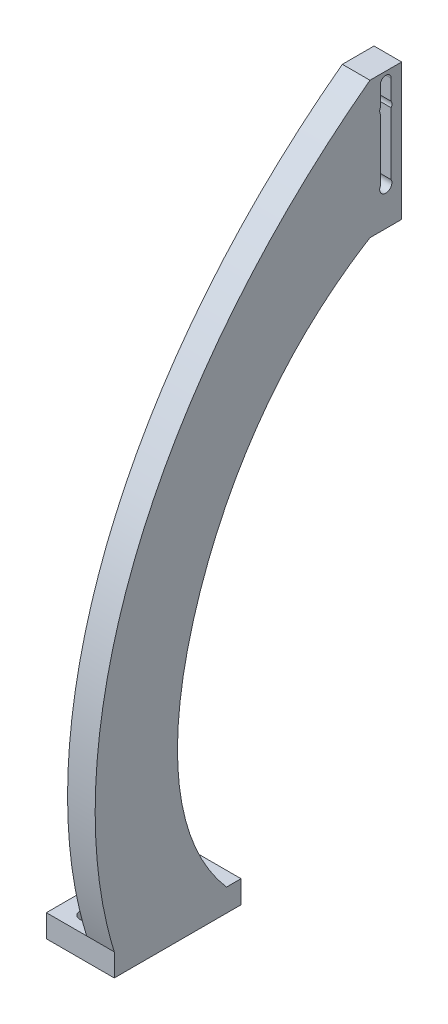
ISO-10303-21;
HEADER;
FILE_DESCRIPTION(('STEP AP214'),'2;1');
FILE_NAME('part.step','',(''),(''),'','','');
FILE_SCHEMA(('AUTOMOTIVE_DESIGN { 1 0 10303 214 1 1 1 1 }'));
ENDSEC;
DATA;
#1=APPLICATION_CONTEXT('core data for automotive mechanical design processes');
#2=APPLICATION_PROTOCOL_DEFINITION('international standard','automotive_design',2000,#1);
#3=PRODUCT_CONTEXT('',#1,'mechanical');
#4=PRODUCT('Part','Part','',(#3));
#5=PRODUCT_RELATED_PRODUCT_CATEGORY('part','',(#4));
#6=PRODUCT_DEFINITION_FORMATION('','',#4);
#7=PRODUCT_DEFINITION_CONTEXT('part definition',#1,'design');
#8=PRODUCT_DEFINITION('design','',#6,#7);
#9=PRODUCT_DEFINITION_SHAPE('','',#8);
#10=(LENGTH_UNIT() NAMED_UNIT(*) SI_UNIT(.MILLI.,.METRE.));
#11=(NAMED_UNIT(*) PLANE_ANGLE_UNIT() SI_UNIT($,.RADIAN.));
#12=(NAMED_UNIT(*) SI_UNIT($,.STERADIAN.) SOLID_ANGLE_UNIT());
#13=UNCERTAINTY_MEASURE_WITH_UNIT(LENGTH_MEASURE(1.E-05),#10,'distance_accuracy_value','');
#14=(GEOMETRIC_REPRESENTATION_CONTEXT(3) GLOBAL_UNCERTAINTY_ASSIGNED_CONTEXT((#13)) GLOBAL_UNIT_ASSIGNED_CONTEXT((#10,
#11,#12)) REPRESENTATION_CONTEXT('',''));
#15=CARTESIAN_POINT('',(0.,0.,0.));
#16=DIRECTION('',(0.,0.,1.));
#17=DIRECTION('',(1.,0.,0.));
#18=AXIS2_PLACEMENT_3D('',#15,#16,#17);
#19=CARTESIAN_POINT('',(-2.,136.5,-45.9823957456189));
#20=DIRECTION('',(1.,0.,0.));
#21=DIRECTION('',(0.,0.,-1.));
#22=AXIS2_PLACEMENT_3D('',#19,#20,#21);
#23=CYLINDRICAL_SURFACE('',#22,1.35);
#24=CARTESIAN_POINT('',(5.,136.5,-45.9823957456189));
#25=DIRECTION('',(1.,0.,0.));
#26=DIRECTION('',(0.,0.,-1.));
#27=AXIS2_PLACEMENT_3D('',#24,#25,#26);
#28=CIRCLE('',#27,1.35);
#29=CARTESIAN_POINT('',(5.,137.118465843843,-44.7823957456189));
#30=VERTEX_POINT('',#29);
#31=CARTESIAN_POINT('',(5.,135.881534156157,-44.7823957456189));
#32=VERTEX_POINT('',#31);
#33=EDGE_CURVE('E235',#30,#32,#28,.T.);
#34=ORIENTED_EDGE('',*,*,#33,.T.);
#35=DIRECTION('',(1.,0.,0.));
#36=VECTOR('',#35,1.);
#37=CARTESIAN_POINT('',(-2.,135.881534156157,-44.7823957456189));
#38=LINE('',#37,#36);
#39=CARTESIAN_POINT('',(-1.09999999999157,135.881534156157,-44.7823957456189));
#40=VERTEX_POINT('',#39);
#41=EDGE_CURVE('E11',#32,#40,#38,.F.);
#42=ORIENTED_EDGE('',*,*,#41,.T.);
#43=CARTESIAN_POINT('',(-1.09999999999153,136.5,-45.9823957456189));
#44=DIRECTION('',(-1.,0.,0.));
#45=DIRECTION('',(0.,-1.,0.));
#46=AXIS2_PLACEMENT_3D('',#43,#44,#45);
#47=CIRCLE('',#46,1.35);
#48=CARTESIAN_POINT('',(-1.09999999999162,137.118465843843,-44.7823957456189));
#49=VERTEX_POINT('',#48);
#50=EDGE_CURVE('E244',#40,#49,#47,.T.);
#51=ORIENTED_EDGE('',*,*,#50,.T.);
#52=DIRECTION('',(1.,0.,0.));
#53=VECTOR('',#52,1.);
#54=CARTESIAN_POINT('',(-2.,137.118465843843,-44.7823957456189));
#55=LINE('',#54,#53);
#56=EDGE_CURVE('E51',#49,#30,#55,.T.);
#57=ORIENTED_EDGE('',*,*,#56,.T.);
#58=EDGE_LOOP('',(#34,#42,#51,#57));
#59=FACE_BOUND('',#58,.T.);
#60=ADVANCED_FACE('F42',(#59),#23,.F.);
#61=CARTESIAN_POINT('',(0.,5.,0.));
#62=DIRECTION('',(0.,1.,0.));
#63=DIRECTION('',(0.,0.,1.));
#64=AXIS2_PLACEMENT_3D('',#61,#62,#63);
#65=PLANE('',#64);
#66=DIRECTION('',(0.,0.,1.));
#67=VECTOR('',#66,1.);
#68=CARTESIAN_POINT('',(5.,5.,14.));
#69=LINE('',#68,#67);
#70=CARTESIAN_POINT('',(5.,5.,-14.));
#71=VERTEX_POINT('',#70);
#72=CARTESIAN_POINT('',(5.,5.,-10.794309538416));
#73=VERTEX_POINT('',#72);
#74=EDGE_CURVE('E218',#71,#73,#69,.T.);
#75=ORIENTED_EDGE('',*,*,#74,.F.);
#76=DIRECTION('',(-1.,0.,0.));
#77=VECTOR('',#76,1.);
#78=CARTESIAN_POINT('',(-10.,5.,-14.));
#79=LINE('',#78,#77);
#80=CARTESIAN_POINT('',(-10.,5.,-14.));
#81=VERTEX_POINT('',#80);
#82=EDGE_CURVE('E443',#71,#81,#79,.T.);
#83=ORIENTED_EDGE('',*,*,#82,.T.);
#84=DIRECTION('',(0.,0.,1.));
#85=VECTOR('',#84,1.);
#86=CARTESIAN_POINT('',(-10.,5.,-14.));
#87=LINE('',#86,#85);
#88=CARTESIAN_POINT('',(-10.,5.,14.));
#89=VERTEX_POINT('',#88);
#90=EDGE_CURVE('E446',#81,#89,#87,.T.);
#91=ORIENTED_EDGE('',*,*,#90,.T.);
#92=DIRECTION('',(1.,0.,0.));
#93=VECTOR('',#92,1.);
#94=CARTESIAN_POINT('',(-10.,5.,14.));
#95=LINE('',#94,#93);
#96=CARTESIAN_POINT('',(-1.10000000000038,5.,14.));
#97=VERTEX_POINT('',#96);
#98=EDGE_CURVE('E449',#89,#97,#95,.T.);
#99=ORIENTED_EDGE('',*,*,#98,.T.);
#100=DIRECTION('',(0.,0.,-1.));
#101=VECTOR('',#100,1.);
#102=CARTESIAN_POINT('',(-1.10000000000035,5.,13.9999999999994));
#103=LINE('',#102,#101);
#104=CARTESIAN_POINT('',(-1.10000000000041,5.,-10.794309538416));
#105=VERTEX_POINT('',#104);
#106=EDGE_CURVE('E289',#97,#105,#103,.T.);
#107=ORIENTED_EDGE('',*,*,#106,.T.);
#108=DIRECTION('',(1.,0.,0.));
#109=VECTOR('',#108,1.);
#110=CARTESIAN_POINT('',(-153.493648523779,5.,-10.794309538416));
#111=LINE('',#110,#109);
#112=EDGE_CURVE('E295',#105,#73,#111,.T.);
#113=ORIENTED_EDGE('',*,*,#112,.T.);
#114=EDGE_LOOP('',(#75,#83,#91,#99,#107,#113));
#115=FACE_BOUND('',#114,.T.);
#116=CARTESIAN_POINT('',(-5.,5.,-10.));
#117=DIRECTION('',(0.,1.,0.));
#118=DIRECTION('',(0.,0.,1.));
#119=AXIS2_PLACEMENT_3D('',#116,#117,#118);
#120=CIRCLE('',#119,1.6);
#121=CARTESIAN_POINT('',(-5.,5.,-8.4));
#122=VERTEX_POINT('',#121);
#123=EDGE_CURVE('E429',#122,#122,#120,.T.);
#124=ORIENTED_EDGE('',*,*,#123,.F.);
#125=EDGE_LOOP('',(#124));
#126=FACE_BOUND('',#125,.T.);
#127=CARTESIAN_POINT('',(-5.,5.,9.99999999999998));
#128=DIRECTION('',(0.,1.,0.));
#129=DIRECTION('',(0.,0.,-1.));
#130=AXIS2_PLACEMENT_3D('',#127,#128,#129);
#131=CIRCLE('',#130,1.6);
#132=CARTESIAN_POINT('',(-5.,5.,8.39999999999998));
#133=VERTEX_POINT('',#132);
#134=EDGE_CURVE('E422',#133,#133,#131,.T.);
#135=ORIENTED_EDGE('',*,*,#134,.F.);
#136=EDGE_LOOP('',(#135));
#137=FACE_BOUND('',#136,.T.);
#138=ADVANCED_FACE('F365',(#115,#126,#137),#65,.T.);
#139=CARTESIAN_POINT('',(0.,0.,0.));
#140=DIRECTION('',(0.,1.,0.));
#141=DIRECTION('',(0.,0.,1.));
#142=AXIS2_PLACEMENT_3D('',#139,#140,#141);
#143=PLANE('',#142);
#144=DIRECTION('',(-1.,0.,0.));
#145=VECTOR('',#144,1.);
#146=CARTESIAN_POINT('',(-10.,0.,-14.));
#147=LINE('',#146,#145);
#148=CARTESIAN_POINT('',(5.,0.,-14.));
#149=VERTEX_POINT('',#148);
#150=CARTESIAN_POINT('',(-10.,0.,-14.));
#151=VERTEX_POINT('',#150);
#152=EDGE_CURVE('E433',#149,#151,#147,.T.);
#153=ORIENTED_EDGE('',*,*,#152,.F.);
#154=DIRECTION('',(0.,0.,1.));
#155=VECTOR('',#154,1.);
#156=CARTESIAN_POINT('',(5.,0.,0.));
#157=LINE('',#156,#155);
#158=CARTESIAN_POINT('',(5.,0.,14.));
#159=VERTEX_POINT('',#158);
#160=EDGE_CURVE('E225',#149,#159,#157,.T.);
#161=ORIENTED_EDGE('',*,*,#160,.T.);
#162=DIRECTION('',(1.,0.,0.));
#163=VECTOR('',#162,1.);
#164=CARTESIAN_POINT('',(-10.,0.,14.));
#165=LINE('',#164,#163);
#166=CARTESIAN_POINT('',(-10.,0.,14.));
#167=VERTEX_POINT('',#166);
#168=EDGE_CURVE('E439',#167,#159,#165,.T.);
#169=ORIENTED_EDGE('',*,*,#168,.F.);
#170=DIRECTION('',(0.,0.,1.));
#171=VECTOR('',#170,1.);
#172=CARTESIAN_POINT('',(-10.,0.,-14.));
#173=LINE('',#172,#171);
#174=EDGE_CURVE('E436',#151,#167,#173,.T.);
#175=ORIENTED_EDGE('',*,*,#174,.F.);
#176=EDGE_LOOP('',(#153,#161,#169,#175));
#177=FACE_BOUND('',#176,.T.);
#178=CARTESIAN_POINT('',(-5.,0.,-10.));
#179=DIRECTION('',(0.,1.,0.));
#180=DIRECTION('',(0.,0.,1.));
#181=AXIS2_PLACEMENT_3D('',#178,#179,#180);
#182=CIRCLE('',#181,1.6);
#183=CARTESIAN_POINT('',(-5.,0.,-8.4));
#184=VERTEX_POINT('',#183);
#185=EDGE_CURVE('E426',#184,#184,#182,.T.);
#186=ORIENTED_EDGE('',*,*,#185,.T.);
#187=EDGE_LOOP('',(#186));
#188=FACE_BOUND('',#187,.T.);
#189=CARTESIAN_POINT('',(-5.,0.,9.99999999999998));
#190=DIRECTION('',(0.,1.,0.));
#191=DIRECTION('',(0.,0.,-1.));
#192=AXIS2_PLACEMENT_3D('',#189,#190,#191);
#193=CIRCLE('',#192,1.6);
#194=CARTESIAN_POINT('',(-5.,0.,8.39999999999998));
#195=VERTEX_POINT('',#194);
#196=EDGE_CURVE('E329',#195,#195,#193,.T.);
#197=ORIENTED_EDGE('',*,*,#196,.T.);
#198=EDGE_LOOP('',(#197));
#199=FACE_BOUND('',#198,.T.);
#200=ADVANCED_FACE('F368',(#177,#188,#199),#143,.F.);
#201=CARTESIAN_POINT('',(-10.,5.,-14.));
#202=DIRECTION('',(0.,0.,1.));
#203=DIRECTION('',(1.,0.,0.));
#204=AXIS2_PLACEMENT_3D('',#201,#202,#203);
#205=PLANE('',#204);
#206=ORIENTED_EDGE('',*,*,#82,.F.);
#207=DIRECTION('',(0.,1.,0.));
#208=VECTOR('',#207,1.);
#209=CARTESIAN_POINT('',(5.,-5.,-14.));
#210=LINE('',#209,#208);
#211=EDGE_CURVE('E221',#149,#71,#210,.T.);
#212=ORIENTED_EDGE('',*,*,#211,.F.);
#213=ORIENTED_EDGE('',*,*,#152,.T.);
#214=DIRECTION('',(0.,-1.,0.));
#215=VECTOR('',#214,1.);
#216=CARTESIAN_POINT('',(-10.,5.,-14.));
#217=LINE('',#216,#215);
#218=EDGE_CURVE('E457',#81,#151,#217,.T.);
#219=ORIENTED_EDGE('',*,*,#218,.F.);
#220=EDGE_LOOP('',(#206,#212,#213,#219));
#221=FACE_BOUND('',#220,.T.);
#222=ADVANCED_FACE('F44',(#221),#205,.F.);
#223=CARTESIAN_POINT('',(-10.,5.,-14.));
#224=DIRECTION('',(1.,0.,0.));
#225=DIRECTION('',(0.,0.,-1.));
#226=AXIS2_PLACEMENT_3D('',#223,#224,#225);
#227=PLANE('',#226);
#228=ORIENTED_EDGE('',*,*,#174,.T.);
#229=DIRECTION('',(0.,-1.,0.));
#230=VECTOR('',#229,1.);
#231=CARTESIAN_POINT('',(-10.,5.,14.));
#232=LINE('',#231,#230);
#233=EDGE_CURVE('E453',#89,#167,#232,.T.);
#234=ORIENTED_EDGE('',*,*,#233,.F.);
#235=ORIENTED_EDGE('',*,*,#90,.F.);
#236=ORIENTED_EDGE('',*,*,#218,.T.);
#237=EDGE_LOOP('',(#228,#234,#235,#236));
#238=FACE_BOUND('',#237,.T.);
#239=ADVANCED_FACE('F374',(#238),#227,.F.);
#240=CARTESIAN_POINT('',(-10.,5.,14.));
#241=DIRECTION('',(0.,0.,-1.));
#242=DIRECTION('',(-1.,0.,0.));
#243=AXIS2_PLACEMENT_3D('',#240,#241,#242);
#244=PLANE('',#243);
#245=ORIENTED_EDGE('',*,*,#168,.T.);
#246=DIRECTION('',(0.,1.,0.));
#247=VECTOR('',#246,1.);
#248=CARTESIAN_POINT('',(5.,-5.,14.));
#249=LINE('',#248,#247);
#250=CARTESIAN_POINT('',(5.,5.,14.));
#251=VERTEX_POINT('',#250);
#252=EDGE_CURVE('E222',#159,#251,#249,.T.);
#253=ORIENTED_EDGE('',*,*,#252,.T.);
#254=DIRECTION('',(1.,0.,0.));
#255=VECTOR('',#254,1.);
#256=CARTESIAN_POINT('',(-153.493648523779,5.,14.));
#257=LINE('',#256,#255);
#258=EDGE_CURVE('E302',#97,#251,#257,.T.);
#259=ORIENTED_EDGE('',*,*,#258,.F.);
#260=ORIENTED_EDGE('',*,*,#98,.F.);
#261=ORIENTED_EDGE('',*,*,#233,.T.);
#262=EDGE_LOOP('',(#245,#253,#259,#260,#261));
#263=FACE_BOUND('',#262,.T.);
#264=ADVANCED_FACE('F363',(#263),#244,.F.);
#265=CARTESIAN_POINT('',(-5.,5.,-10.));
#266=DIRECTION('',(0.,-1.,0.));
#267=DIRECTION('',(0.,0.,-1.));
#268=AXIS2_PLACEMENT_3D('',#265,#266,#267);
#269=CYLINDRICAL_SURFACE('',#268,1.6);
#270=ORIENTED_EDGE('',*,*,#123,.T.);
#271=EDGE_LOOP('',(#270));
#272=FACE_BOUND('',#271,.T.);
#273=ORIENTED_EDGE('',*,*,#185,.F.);
#274=EDGE_LOOP('',(#273));
#275=FACE_BOUND('',#274,.T.);
#276=ADVANCED_FACE('F359',(#272,#275),#269,.F.);
#277=CARTESIAN_POINT('',(-5.,5.,9.99999999999998));
#278=DIRECTION('',(0.,-1.,0.));
#279=DIRECTION('',(0.,0.,-1.));
#280=AXIS2_PLACEMENT_3D('',#277,#278,#279);
#281=CYLINDRICAL_SURFACE('',#280,1.6);
#282=ORIENTED_EDGE('',*,*,#134,.T.);
#283=EDGE_LOOP('',(#282));
#284=FACE_BOUND('',#283,.T.);
#285=ORIENTED_EDGE('',*,*,#196,.F.);
#286=EDGE_LOOP('',(#285));
#287=FACE_BOUND('',#286,.T.);
#288=ADVANCED_FACE('F355',(#284,#287),#281,.F.);
#289=CARTESIAN_POINT('',(-1.10000000000133,-6.49999999999645,-42.4823957456187));
#290=DIRECTION('',(-1.,0.,0.));
#291=DIRECTION('',(0.,0.,-1.));
#292=AXIS2_PLACEMENT_3D('',#289,#290,#291);
#293=PLANE('',#292);
#294=DIRECTION('',(0.,1.,0.));
#295=VECTOR('',#294,1.);
#296=CARTESIAN_POINT('',(-1.10000000000134,-6.49999999999645,-44.7823957456189));
#297=LINE('',#296,#295);
#298=CARTESIAN_POINT('',(-1.09999999999251,122.118465843843,-44.7823957456189));
#299=VERTEX_POINT('',#298);
#300=EDGE_CURVE('E211',#299,#40,#297,.T.);
#301=ORIENTED_EDGE('',*,*,#300,.F.);
#302=CARTESIAN_POINT('',(-1.09999999999256,121.5,-45.9823957456189));
#303=DIRECTION('',(-1.,0.,0.));
#304=DIRECTION('',(0.,-1.,0.));
#305=AXIS2_PLACEMENT_3D('',#302,#303,#304);
#306=CIRCLE('',#305,1.35);
#307=CARTESIAN_POINT('',(-1.09999999999252,122.118465843843,-47.1823957456189));
#308=VERTEX_POINT('',#307);
#309=EDGE_CURVE('E239',#308,#299,#306,.T.);
#310=ORIENTED_EDGE('',*,*,#309,.F.);
#311=DIRECTION('',(0.,-1.,0.));
#312=VECTOR('',#311,1.);
#313=CARTESIAN_POINT('',(-1.10000000000135,-6.49999999999645,-47.1823957456189));
#314=LINE('',#313,#312);
#315=CARTESIAN_POINT('',(-1.09999999999162,135.881534156157,-47.1823957456189));
#316=VERTEX_POINT('',#315);
#317=EDGE_CURVE('E200',#316,#308,#314,.T.);
#318=ORIENTED_EDGE('',*,*,#317,.F.);
#319=CARTESIAN_POINT('',(-1.09999999999149,137.118465843843,-47.1823957456189));
#320=VERTEX_POINT('',#319);
#321=EDGE_CURVE('E243',#320,#316,#47,.T.);
#322=ORIENTED_EDGE('',*,*,#321,.F.);
#323=CARTESIAN_POINT('',(-1.09999999999187,141.5,-47.1823957456189));
#324=VERTEX_POINT('',#323);
#325=EDGE_CURVE('E66',#324,#320,#314,.T.);
#326=ORIENTED_EDGE('',*,*,#325,.F.);
#327=CARTESIAN_POINT('',(-1.09999999999118,141.5,-45.9823957456189));
#328=DIRECTION('',(-1.,0.,0.));
#329=DIRECTION('',(0.,-1.,0.));
#330=AXIS2_PLACEMENT_3D('',#327,#328,#329);
#331=CIRCLE('',#330,1.2);
#332=CARTESIAN_POINT('',(-1.09999999999127,141.5,-44.7823957456189));
#333=VERTEX_POINT('',#332);
#334=EDGE_CURVE('E173',#333,#324,#331,.T.);
#335=ORIENTED_EDGE('',*,*,#334,.F.);
#336=EDGE_CURVE('E208',#49,#333,#297,.T.);
#337=ORIENTED_EDGE('',*,*,#336,.F.);
#338=ORIENTED_EDGE('',*,*,#50,.F.);
#339=EDGE_LOOP('',(#301,#310,#318,#322,#326,#335,#337,#338));
#340=FACE_BOUND('',#339,.T.);
#341=CARTESIAN_POINT('',(-1.10000000000132,143.5,-42.4823957456188));
#342=CARTESIAN_POINT('',(-1.10000000000132,126.307389699459,-19.3189401750505));
#343=CARTESIAN_POINT('',(-1.10000000000132,83.5996229215115,16.0596028367935));
#344=CARTESIAN_POINT('',(-1.10000000000132,28.0723834358633,21.0909800526701));
#345=CARTESIAN_POINT('',(-1.10000000000132,5.,14.));
#346=B_SPLINE_CURVE_WITH_KNOTS('',3,(#341,#342,#343,#344,#345),.UNSPECIFIED.,.F.,.F.,(4,1,4),
(0.,0.547613245506543,1.),.UNSPECIFIED.);
#347=CARTESIAN_POINT('',(-1.09999999999102,143.5,-42.4823957456189));
#348=VERTEX_POINT('',#347);
#349=EDGE_CURVE('E296',#348,#97,#346,.T.);
#350=ORIENTED_EDGE('',*,*,#349,.F.);
#351=DIRECTION('',(0.,0.,1.));
#352=VECTOR('',#351,1.);
#353=CARTESIAN_POINT('',(-1.09999999999102,143.5,-49.4823957456189));
#354=LINE('',#353,#352);
#355=CARTESIAN_POINT('',(-1.09999999999102,143.5,-49.4823957456189));
#356=VERTEX_POINT('',#355);
#357=EDGE_CURVE('E264',#356,#348,#354,.T.);
#358=ORIENTED_EDGE('',*,*,#357,.F.);
#359=DIRECTION('',(3.41817128327447E-13,1.,0.));
#360=VECTOR('',#359,1.);
#361=CARTESIAN_POINT('',(-1.10000000000132,113.374773087632,-49.4823957456189));
#362=LINE('',#361,#360);
#363=CARTESIAN_POINT('',(-1.10000000000132,113.374773087632,-49.4823957456189));
#364=VERTEX_POINT('',#363);
#365=EDGE_CURVE('E255',#364,#356,#362,.T.);
#366=ORIENTED_EDGE('',*,*,#365,.F.);
#367=DIRECTION('',(0.,0.,1.));
#368=VECTOR('',#367,1.);
#369=CARTESIAN_POINT('',(-1.10000000000132,113.374773087632,-49.4823957456189));
#370=LINE('',#369,#368);
#371=CARTESIAN_POINT('',(-1.10000000000132,113.374773087632,-42.4823957456189));
#372=VERTEX_POINT('',#371);
#373=EDGE_CURVE('E267',#364,#372,#370,.T.);
#374=ORIENTED_EDGE('',*,*,#373,.T.);
#375=CARTESIAN_POINT('',(-1.10000000000132,5.,-10.794309538416));
#376=CARTESIAN_POINT('',(-1.10000000000132,21.7001632070096,3.62550837576873));
#377=CARTESIAN_POINT('',(-1.10000000000132,68.5304940388407,0.0388749019147612));
#378=CARTESIAN_POINT('',(-1.10000000000132,102.563540471866,-24.7866435793691));
#379=CARTESIAN_POINT('',(-1.10000000000132,113.374773087632,-42.4823957456189));
#380=B_SPLINE_CURVE_WITH_KNOTS('',3,(#375,#376,#377,#378,#379),.UNSPECIFIED.,.F.,.F.,(4,1,4),
(0.,0.510479211791621,1.),.UNSPECIFIED.);
#381=EDGE_CURVE('E304',#105,#372,#380,.T.);
#382=ORIENTED_EDGE('',*,*,#381,.F.);
#383=ORIENTED_EDGE('',*,*,#106,.F.);
#384=EDGE_LOOP('',(#350,#358,#366,#374,#382,#383));
#385=FACE_BOUND('',#384,.T.);
#386=ADVANCED_FACE('F351',(#340,#385),#293,.T.);
#387=CARTESIAN_POINT('',(-153.493648523779,5.,-10.794309538416));
#388=CARTESIAN_POINT('',(-153.493648523779,21.7001632070096,3.62550837576873));
#389=CARTESIAN_POINT('',(-153.493648523779,68.5304940388407,0.0388749019147612));
#390=CARTESIAN_POINT('',(-153.493648523779,102.563540471866,-24.7866435793691));
#391=CARTESIAN_POINT('',(-153.493648523779,113.374773087632,-42.4823957456189));
#392=B_SPLINE_CURVE_WITH_KNOTS('',3,(#387,#388,#389,#390,#391),.UNSPECIFIED.,.F.,.F.,(4,1,4),
(0.,0.510479211791621,1.),.UNSPECIFIED.);
#393=DIRECTION('',(1.,0.,0.));
#394=VECTOR('',#393,1.);
#395=SURFACE_OF_LINEAR_EXTRUSION('',#392,#394);
#396=ORIENTED_EDGE('',*,*,#112,.F.);
#397=ORIENTED_EDGE('',*,*,#381,.T.);
#398=DIRECTION('',(1.,0.,0.));
#399=VECTOR('',#398,1.);
#400=CARTESIAN_POINT('',(-153.493648523779,113.374773087632,-42.4823957456189));
#401=LINE('',#400,#399);
#402=CARTESIAN_POINT('',(5.,113.374773087632,-42.4823957456189));
#403=VERTEX_POINT('',#402);
#404=EDGE_CURVE('E313',#372,#403,#401,.T.);
#405=ORIENTED_EDGE('',*,*,#404,.T.);
#406=CARTESIAN_POINT('',(5.,5.,-10.794309538416));
#407=CARTESIAN_POINT('',(5.,21.7001632070096,3.62550837576873));
#408=CARTESIAN_POINT('',(5.,68.5304940388407,0.0388749019147612));
#409=CARTESIAN_POINT('',(5.,102.563540471866,-24.7866435793691));
#410=CARTESIAN_POINT('',(5.,113.374773087632,-42.4823957456189));
#411=B_SPLINE_CURVE_WITH_KNOTS('',3,(#406,#407,#408,#409,#410),.UNSPECIFIED.,.F.,.F.,(4,1,4),
(0.,0.510479211791621,1.),.UNSPECIFIED.);
#412=EDGE_CURVE('E280',#73,#403,#411,.T.);
#413=ORIENTED_EDGE('',*,*,#412,.F.);
#414=EDGE_LOOP('',(#396,#397,#405,#413));
#415=FACE_BOUND('',#414,.T.);
#416=ADVANCED_FACE('F346',(#415),#395,.T.);
#417=CARTESIAN_POINT('',(-153.493648523779,143.5,-42.4823957456188));
#418=CARTESIAN_POINT('',(-153.493648523779,126.307389699459,-19.3189401750505));
#419=CARTESIAN_POINT('',(-153.493648523779,83.5996229215115,16.0596028367935));
#420=CARTESIAN_POINT('',(-153.493648523779,28.0723834358633,21.0909800526701));
#421=CARTESIAN_POINT('',(-153.493648523779,5.,14.));
#422=B_SPLINE_CURVE_WITH_KNOTS('',3,(#417,#418,#419,#420,#421),.UNSPECIFIED.,.F.,.F.,(4,1,4),
(0.,0.547613245506543,1.),.UNSPECIFIED.);
#423=DIRECTION('',(1.,0.,0.));
#424=VECTOR('',#423,1.);
#425=SURFACE_OF_LINEAR_EXTRUSION('',#422,#424);
#426=DIRECTION('',(1.,0.,0.));
#427=VECTOR('',#426,1.);
#428=CARTESIAN_POINT('',(-153.493648523779,143.5,-42.4823957456189));
#429=LINE('',#428,#427);
#430=CARTESIAN_POINT('',(5.,143.5,-42.4823957456189));
#431=VERTEX_POINT('',#430);
#432=EDGE_CURVE('E303',#348,#431,#429,.T.);
#433=ORIENTED_EDGE('',*,*,#432,.F.);
#434=ORIENTED_EDGE('',*,*,#349,.T.);
#435=ORIENTED_EDGE('',*,*,#258,.T.);
#436=CARTESIAN_POINT('',(5.,143.5,-42.4823957456188));
#437=CARTESIAN_POINT('',(5.,126.307389699459,-19.3189401750505));
#438=CARTESIAN_POINT('',(5.,83.5996229215115,16.0596028367935));
#439=CARTESIAN_POINT('',(5.,28.0723834358633,21.0909800526701));
#440=CARTESIAN_POINT('',(5.,5.,14.));
#441=B_SPLINE_CURVE_WITH_KNOTS('',3,(#436,#437,#438,#439,#440),.UNSPECIFIED.,.F.,.F.,(4,1,4),
(0.,0.547613245506543,1.),.UNSPECIFIED.);
#442=EDGE_CURVE('E274',#431,#251,#441,.T.);
#443=ORIENTED_EDGE('',*,*,#442,.F.);
#444=EDGE_LOOP('',(#433,#434,#435,#443));
#445=FACE_BOUND('',#444,.T.);
#446=ADVANCED_FACE('F342',(#445),#425,.T.);
#447=CARTESIAN_POINT('',(5.,82.7027915395324,7.44548077944378));
#448=DIRECTION('',(1.,0.,0.));
#449=DIRECTION('',(0.,0.,-1.));
#450=AXIS2_PLACEMENT_3D('',#447,#448,#449);
#451=PLANE('',#450);
#452=DIRECTION('',(0.,-1.,0.));
#453=VECTOR('',#452,1.);
#454=CARTESIAN_POINT('',(5.,121.5,-44.7823957456189));
#455=LINE('',#454,#453);
#456=CARTESIAN_POINT('',(5.,122.118465843843,-44.7823957456189));
#457=VERTEX_POINT('',#456);
#458=EDGE_CURVE('E192',#32,#457,#455,.T.);
#459=ORIENTED_EDGE('',*,*,#458,.F.);
#460=ORIENTED_EDGE('',*,*,#33,.F.);
#461=CARTESIAN_POINT('',(5.,141.5,-44.7823957456189));
#462=VERTEX_POINT('',#461);
#463=EDGE_CURVE('E176',#462,#30,#455,.T.);
#464=ORIENTED_EDGE('',*,*,#463,.F.);
#465=CARTESIAN_POINT('',(5.,141.5,-45.9823957456189));
#466=DIRECTION('',(1.,0.,0.));
#467=DIRECTION('',(0.,0.,-1.));
#468=AXIS2_PLACEMENT_3D('',#465,#466,#467);
#469=CIRCLE('',#468,1.2);
#470=CARTESIAN_POINT('',(5.,141.5,-47.1823957456189));
#471=VERTEX_POINT('',#470);
#472=EDGE_CURVE('E170',#471,#462,#469,.T.);
#473=ORIENTED_EDGE('',*,*,#472,.F.);
#474=DIRECTION('',(0.,1.,0.));
#475=VECTOR('',#474,1.);
#476=CARTESIAN_POINT('',(5.,121.5,-47.1823957456189));
#477=LINE('',#476,#475);
#478=CARTESIAN_POINT('',(5.,137.118465843843,-47.1823957456189));
#479=VERTEX_POINT('',#478);
#480=EDGE_CURVE('E179',#479,#471,#477,.T.);
#481=ORIENTED_EDGE('',*,*,#480,.F.);
#482=CARTESIAN_POINT('',(5.,135.881534156157,-47.1823957456189));
#483=VERTEX_POINT('',#482);
#484=EDGE_CURVE('E232',#483,#479,#28,.T.);
#485=ORIENTED_EDGE('',*,*,#484,.F.);
#486=CARTESIAN_POINT('',(5.,122.118465843843,-47.1823957456189));
#487=VERTEX_POINT('',#486);
#488=EDGE_CURVE('E58',#487,#483,#477,.T.);
#489=ORIENTED_EDGE('',*,*,#488,.F.);
#490=CARTESIAN_POINT('',(5.,121.5,-45.9823957456189));
#491=DIRECTION('',(1.,0.,0.));
#492=DIRECTION('',(0.,0.,-1.));
#493=AXIS2_PLACEMENT_3D('',#490,#491,#492);
#494=CIRCLE('',#493,1.35);
#495=EDGE_CURVE('E231',#457,#487,#494,.T.);
#496=ORIENTED_EDGE('',*,*,#495,.F.);
#497=EDGE_LOOP('',(#459,#460,#464,#473,#481,#485,#489,#496));
#498=FACE_BOUND('',#497,.T.);
#499=ORIENTED_EDGE('',*,*,#442,.T.);
#500=ORIENTED_EDGE('',*,*,#252,.F.);
#501=ORIENTED_EDGE('',*,*,#160,.F.);
#502=ORIENTED_EDGE('',*,*,#211,.T.);
#503=ORIENTED_EDGE('',*,*,#74,.T.);
#504=ORIENTED_EDGE('',*,*,#412,.T.);
#505=DIRECTION('',(0.,0.,1.));
#506=VECTOR('',#505,1.);
#507=CARTESIAN_POINT('',(5.,113.374773087632,-49.4823957456189));
#508=LINE('',#507,#506);
#509=CARTESIAN_POINT('',(5.,113.374773087632,-49.4823957456189));
#510=VERTEX_POINT('',#509);
#511=EDGE_CURVE('E271',#510,#403,#508,.T.);
#512=ORIENTED_EDGE('',*,*,#511,.F.);
#513=DIRECTION('',(0.,-1.,0.));
#514=VECTOR('',#513,1.);
#515=CARTESIAN_POINT('',(5.,143.5,-49.4823957456189));
#516=LINE('',#515,#514);
#517=CARTESIAN_POINT('',(5.,143.5,-49.4823957456189));
#518=VERTEX_POINT('',#517);
#519=EDGE_CURVE('E248',#518,#510,#516,.T.);
#520=ORIENTED_EDGE('',*,*,#519,.F.);
#521=DIRECTION('',(0.,0.,1.));
#522=VECTOR('',#521,1.);
#523=CARTESIAN_POINT('',(5.,143.5,-49.4823957456189));
#524=LINE('',#523,#522);
#525=EDGE_CURVE('E261',#518,#431,#524,.T.);
#526=ORIENTED_EDGE('',*,*,#525,.T.);
#527=EDGE_LOOP('',(#499,#500,#501,#502,#503,#504,#512,#520,#526));
#528=FACE_BOUND('',#527,.T.);
#529=ADVANCED_FACE('F188',(#498,#528),#451,.T.);
#530=CARTESIAN_POINT('',(5.,113.374773087632,-49.4823957456189));
#531=DIRECTION('',(0.,1.,0.));
#532=DIRECTION('',(0.,0.,1.));
#533=AXIS2_PLACEMENT_3D('',#530,#531,#532);
#534=PLANE('',#533);
#535=ORIENTED_EDGE('',*,*,#404,.F.);
#536=ORIENTED_EDGE('',*,*,#373,.F.);
#537=DIRECTION('',(-1.,0.,0.));
#538=VECTOR('',#537,1.);
#539=CARTESIAN_POINT('',(5.,113.374773087632,-49.4823957456189));
#540=LINE('',#539,#538);
#541=EDGE_CURVE('E252',#510,#364,#540,.T.);
#542=ORIENTED_EDGE('',*,*,#541,.F.);
#543=ORIENTED_EDGE('',*,*,#511,.T.);
#544=EDGE_LOOP('',(#535,#536,#542,#543));
#545=FACE_BOUND('',#544,.T.);
#546=ADVANCED_FACE('F538',(#545),#534,.F.);
#547=CARTESIAN_POINT('',(-1.09999999999102,143.5,-49.4823957456189));
#548=DIRECTION('',(0.,-1.,0.));
#549=DIRECTION('',(0.,0.,-1.));
#550=AXIS2_PLACEMENT_3D('',#547,#548,#549);
#551=PLANE('',#550);
#552=ORIENTED_EDGE('',*,*,#432,.T.);
#553=ORIENTED_EDGE('',*,*,#525,.F.);
#554=DIRECTION('',(1.,0.,0.));
#555=VECTOR('',#554,1.);
#556=CARTESIAN_POINT('',(-1.09999999999102,143.5,-49.4823957456189));
#557=LINE('',#556,#555);
#558=EDGE_CURVE('E258',#356,#518,#557,.T.);
#559=ORIENTED_EDGE('',*,*,#558,.F.);
#560=ORIENTED_EDGE('',*,*,#357,.T.);
#561=EDGE_LOOP('',(#552,#553,#559,#560));
#562=FACE_BOUND('',#561,.T.);
#563=ADVANCED_FACE('F530',(#562),#551,.F.);
#564=CARTESIAN_POINT('',(0.,0.,-49.4823957456189));
#565=DIRECTION('',(0.,0.,-1.));
#566=DIRECTION('',(0.,1.,0.));
#567=AXIS2_PLACEMENT_3D('',#564,#565,#566);
#568=PLANE('',#567);
#569=ORIENTED_EDGE('',*,*,#519,.T.);
#570=ORIENTED_EDGE('',*,*,#541,.T.);
#571=ORIENTED_EDGE('',*,*,#365,.T.);
#572=ORIENTED_EDGE('',*,*,#558,.T.);
#573=EDGE_LOOP('',(#569,#570,#571,#572));
#574=FACE_BOUND('',#573,.T.);
#575=ADVANCED_FACE('F401',(#574),#568,.T.);
#576=CARTESIAN_POINT('',(-2.,121.5,-45.9823957456189));
#577=DIRECTION('',(1.,0.,0.));
#578=DIRECTION('',(0.,0.,-1.));
#579=AXIS2_PLACEMENT_3D('',#576,#577,#578);
#580=CYLINDRICAL_SURFACE('',#579,1.35);
#581=ORIENTED_EDGE('',*,*,#309,.T.);
#582=DIRECTION('',(1.,0.,0.));
#583=VECTOR('',#582,1.);
#584=CARTESIAN_POINT('',(-2.,122.118465843843,-44.7823957456189));
#585=LINE('',#584,#583);
#586=EDGE_CURVE('E212',#299,#457,#585,.T.);
#587=ORIENTED_EDGE('',*,*,#586,.T.);
#588=ORIENTED_EDGE('',*,*,#495,.T.);
#589=DIRECTION('',(1.,0.,0.));
#590=VECTOR('',#589,1.);
#591=CARTESIAN_POINT('',(-2.,122.118465843843,-47.1823957456189));
#592=LINE('',#591,#590);
#593=EDGE_CURVE('E204',#487,#308,#592,.F.);
#594=ORIENTED_EDGE('',*,*,#593,.T.);
#595=EDGE_LOOP('',(#581,#587,#588,#594));
#596=FACE_BOUND('',#595,.T.);
#597=ADVANCED_FACE('F394',(#596),#580,.F.);
#598=ORIENTED_EDGE('',*,*,#484,.T.);
#599=DIRECTION('',(1.,0.,0.));
#600=VECTOR('',#599,1.);
#601=CARTESIAN_POINT('',(-2.,137.118465843843,-47.1823957456189));
#602=LINE('',#601,#600);
#603=EDGE_CURVE('E181',#479,#320,#602,.F.);
#604=ORIENTED_EDGE('',*,*,#603,.T.);
#605=ORIENTED_EDGE('',*,*,#321,.T.);
#606=DIRECTION('',(1.,0.,0.));
#607=VECTOR('',#606,1.);
#608=CARTESIAN_POINT('',(-2.,135.881534156157,-47.1823957456189));
#609=LINE('',#608,#607);
#610=EDGE_CURVE('E405',#316,#483,#609,.T.);
#611=ORIENTED_EDGE('',*,*,#610,.T.);
#612=EDGE_LOOP('',(#598,#604,#605,#611));
#613=FACE_BOUND('',#612,.T.);
#614=ADVANCED_FACE('F385',(#613),#23,.F.);
#615=CARTESIAN_POINT('',(-5.,121.5,-47.1823957456189));
#616=DIRECTION('',(0.,0.,-1.));
#617=DIRECTION('',(-1.,0.,0.));
#618=AXIS2_PLACEMENT_3D('',#615,#616,#617);
#619=PLANE('',#618);
#620=ORIENTED_EDGE('',*,*,#488,.T.);
#621=ORIENTED_EDGE('',*,*,#610,.F.);
#622=ORIENTED_EDGE('',*,*,#317,.T.);
#623=ORIENTED_EDGE('',*,*,#593,.F.);
#624=EDGE_LOOP('',(#620,#621,#622,#623));
#625=FACE_BOUND('',#624,.T.);
#626=ADVANCED_FACE('F393',(#625),#619,.F.);
#627=ORIENTED_EDGE('',*,*,#325,.T.);
#628=ORIENTED_EDGE('',*,*,#603,.F.);
#629=ORIENTED_EDGE('',*,*,#480,.T.);
#630=DIRECTION('',(1.,0.,0.));
#631=VECTOR('',#630,1.);
#632=CARTESIAN_POINT('',(-5.,141.5,-47.1823957456189));
#633=LINE('',#632,#631);
#634=EDGE_CURVE('E165',#324,#471,#633,.T.);
#635=ORIENTED_EDGE('',*,*,#634,.F.);
#636=EDGE_LOOP('',(#627,#628,#629,#635));
#637=FACE_BOUND('',#636,.T.);
#638=ADVANCED_FACE('F180',(#637),#619,.F.);
#639=CARTESIAN_POINT('',(-5.,121.5,-44.7823957456189));
#640=DIRECTION('',(0.,0.,1.));
#641=DIRECTION('',(1.,0.,0.));
#642=AXIS2_PLACEMENT_3D('',#639,#640,#641);
#643=PLANE('',#642);
#644=ORIENTED_EDGE('',*,*,#336,.T.);
#645=DIRECTION('',(1.,0.,0.));
#646=VECTOR('',#645,1.);
#647=CARTESIAN_POINT('',(-5.,141.5,-44.7823957456189));
#648=LINE('',#647,#646);
#649=EDGE_CURVE('E175',#333,#462,#648,.T.);
#650=ORIENTED_EDGE('',*,*,#649,.T.);
#651=ORIENTED_EDGE('',*,*,#463,.T.);
#652=ORIENTED_EDGE('',*,*,#56,.F.);
#653=EDGE_LOOP('',(#644,#650,#651,#652));
#654=FACE_BOUND('',#653,.T.);
#655=ADVANCED_FACE('F468',(#654),#643,.F.);
#656=CARTESIAN_POINT('',(-5.,141.5,-45.9823957456189));
#657=DIRECTION('',(1.,0.,0.));
#658=DIRECTION('',(0.,0.,-1.));
#659=AXIS2_PLACEMENT_3D('',#656,#657,#658);
#660=CYLINDRICAL_SURFACE('',#659,1.2);
#661=ORIENTED_EDGE('',*,*,#334,.T.);
#662=ORIENTED_EDGE('',*,*,#634,.T.);
#663=ORIENTED_EDGE('',*,*,#472,.T.);
#664=ORIENTED_EDGE('',*,*,#649,.F.);
#665=EDGE_LOOP('',(#661,#662,#663,#664));
#666=FACE_BOUND('',#665,.T.);
#667=ADVANCED_FACE('F167',(#666),#660,.F.);
#668=ORIENTED_EDGE('',*,*,#300,.T.);
#669=ORIENTED_EDGE('',*,*,#41,.F.);
#670=ORIENTED_EDGE('',*,*,#458,.T.);
#671=ORIENTED_EDGE('',*,*,#586,.F.);
#672=EDGE_LOOP('',(#668,#669,#670,#671));
#673=FACE_BOUND('',#672,.T.);
#674=ADVANCED_FACE('F410',(#673),#643,.F.);
#675=CLOSED_SHELL('',(#60,#138,#200,#222,#239,#264,#276,#288,#386,#416,#446,#529,#546,#563,#575,
#597,#614,#626,#638,#655,#667,#674));
#676=MANIFOLD_SOLID_BREP('B2',#675);
#677=ADVANCED_BREP_SHAPE_REPRESENTATION('',(#18,#676),#14);
#678=SHAPE_DEFINITION_REPRESENTATION(#9,#677);
ENDSEC;
END-ISO-10303-21;
